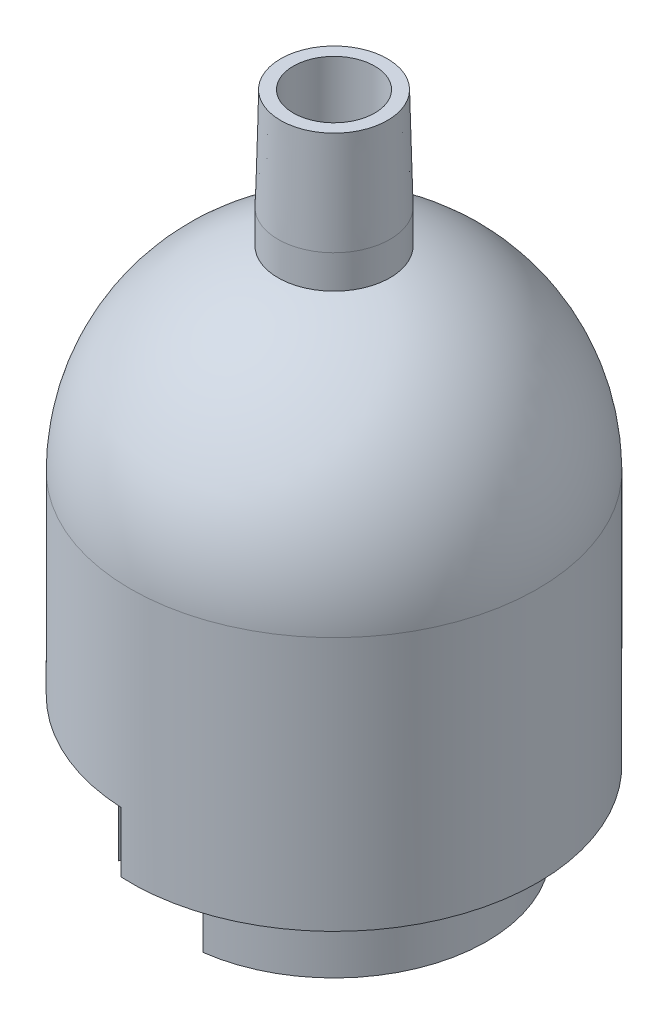
ISO-10303-21;
HEADER;
FILE_DESCRIPTION(('STEP AP214'),'2;1');
FILE_NAME('part.step','',(''),(''),'','','');
FILE_SCHEMA(('AUTOMOTIVE_DESIGN { 1 0 10303 214 1 1 1 1 }'));
ENDSEC;
DATA;
#1=APPLICATION_CONTEXT('core data for automotive mechanical design processes');
#2=APPLICATION_PROTOCOL_DEFINITION('international standard','automotive_design',2000,#1);
#3=PRODUCT_CONTEXT('',#1,'mechanical');
#4=PRODUCT('Part','Part','',(#3));
#5=PRODUCT_RELATED_PRODUCT_CATEGORY('part','',(#4));
#6=PRODUCT_DEFINITION_FORMATION('','',#4);
#7=PRODUCT_DEFINITION_CONTEXT('part definition',#1,'design');
#8=PRODUCT_DEFINITION('design','',#6,#7);
#9=PRODUCT_DEFINITION_SHAPE('','',#8);
#10=(LENGTH_UNIT() NAMED_UNIT(*) SI_UNIT(.MILLI.,.METRE.));
#11=(NAMED_UNIT(*) PLANE_ANGLE_UNIT() SI_UNIT($,.RADIAN.));
#12=(NAMED_UNIT(*) SI_UNIT($,.STERADIAN.) SOLID_ANGLE_UNIT());
#13=UNCERTAINTY_MEASURE_WITH_UNIT(LENGTH_MEASURE(1.E-05),#10,'distance_accuracy_value','');
#14=(GEOMETRIC_REPRESENTATION_CONTEXT(3) GLOBAL_UNCERTAINTY_ASSIGNED_CONTEXT((#13)) GLOBAL_UNIT_ASSIGNED_CONTEXT((#10,
#11,#12)) REPRESENTATION_CONTEXT('',''));
#15=CARTESIAN_POINT('',(0.,0.,0.));
#16=DIRECTION('',(0.,0.,1.));
#17=DIRECTION('',(1.,0.,0.));
#18=AXIS2_PLACEMENT_3D('',#15,#16,#17);
#19=CARTESIAN_POINT('',(0.,0.,0.));
#20=DIRECTION('',(0.,1.,0.));
#21=DIRECTION('',(0.,0.,1.));
#22=AXIS2_PLACEMENT_3D('',#19,#20,#21);
#23=PLANE('',#22);
#24=CARTESIAN_POINT('',(-14.4274561926336,0.,-19.8576898619304));
#25=DIRECTION('',(0.,-1.,0.));
#26=DIRECTION('',(0.,0.,-1.));
#27=AXIS2_PLACEMENT_3D('',#24,#25,#26);
#28=CIRCLE('',#27,1.02272727272727);
#29=CARTESIAN_POINT('',(-14.4274561926336,0.,-20.8804171346577));
#30=VERTEX_POINT('',#29);
#31=EDGE_CURVE('E284',#30,#30,#28,.T.);
#32=ORIENTED_EDGE('',*,*,#31,.F.);
#33=EDGE_LOOP('',(#32));
#34=FACE_BOUND('',#33,.T.);
#35=CARTESIAN_POINT('',(-23.3441144908811,0.,-7.58496258920303));
#36=DIRECTION('',(0.,-1.,0.));
#37=DIRECTION('',(0.,0.,-1.));
#38=AXIS2_PLACEMENT_3D('',#35,#36,#37);
#39=CIRCLE('',#38,1.02272727272727);
#40=CARTESIAN_POINT('',(-23.3441144908811,0.,-8.6076898619303));
#41=VERTEX_POINT('',#40);
#42=EDGE_CURVE('E267',#41,#41,#39,.T.);
#43=ORIENTED_EDGE('',*,*,#42,.F.);
#44=EDGE_LOOP('',(#43));
#45=FACE_BOUND('',#44,.T.);
#46=CARTESIAN_POINT('',(-23.344114490881,0.,7.58496258920352));
#47=DIRECTION('',(0.,-1.,0.));
#48=DIRECTION('',(0.,0.,-1.));
#49=AXIS2_PLACEMENT_3D('',#46,#47,#48);
#50=CIRCLE('',#49,1.02272727272727);
#51=CARTESIAN_POINT('',(-23.344114490881,0.,6.56223531647624));
#52=VERTEX_POINT('',#51);
#53=EDGE_CURVE('E238',#52,#52,#50,.T.);
#54=ORIENTED_EDGE('',*,*,#53,.F.);
#55=EDGE_LOOP('',(#54));
#56=FACE_BOUND('',#55,.T.);
#57=DIRECTION('',(-0.819178042205052,0.,0.573539305688021));
#58=VECTOR('',#57,1.);
#59=CARTESIAN_POINT('',(-2.60200663660479,0.,-3.71640911309731));
#60=LINE('',#59,#58);
#61=CARTESIAN_POINT('',(-20.6549486371412,0.,8.92317750563435));
#62=VERTEX_POINT('',#61);
#63=CARTESIAN_POINT('',(-24.6319495458198,0.,11.7076348792039));
#64=VERTEX_POINT('',#63);
#65=EDGE_CURVE('E203',#62,#64,#60,.T.);
#66=ORIENTED_EDGE('',*,*,#65,.T.);
#67=CARTESIAN_POINT('',(0.,0.,0.));
#68=DIRECTION('',(0.,1.,0.));
#69=DIRECTION('',(0.,0.,1.));
#70=AXIS2_PLACEMENT_3D('',#67,#68,#69);
#71=CIRCLE('',#70,27.2727272727273);
#72=CARTESIAN_POINT('',(-13.2994690319406,0.,-23.8102031986503));
#73=VERTEX_POINT('',#72);
#74=EDGE_CURVE('E67',#73,#64,#71,.T.);
#75=ORIENTED_EDGE('',*,*,#74,.F.);
#76=DIRECTION('',(-0.487647197837817,0.,-0.873040783950512));
#77=VECTOR('',#76,1.);
#78=CARTESIAN_POINT('',(0.,0.,0.));
#79=LINE('',#78,#77);
#80=CARTESIAN_POINT('',(-10.972061951351,0.,-19.6434176388865));
#81=VERTEX_POINT('',#80);
#82=EDGE_CURVE('E230',#81,#73,#79,.T.);
#83=ORIENTED_EDGE('',*,*,#82,.F.);
#84=CARTESIAN_POINT('',(0.,0.,0.));
#85=DIRECTION('',(0.,-1.,0.));
#86=DIRECTION('',(0.,0.,-1.));
#87=AXIS2_PLACEMENT_3D('',#84,#85,#86);
#88=CIRCLE('',#87,22.5);
#89=EDGE_CURVE('E227',#62,#81,#88,.T.);
#90=ORIENTED_EDGE('',*,*,#89,.F.);
#91=EDGE_LOOP('',(#66,#75,#83,#90));
#92=FACE_BOUND('',#91,.T.);
#93=ADVANCED_FACE('F56',(#34,#45,#56,#92),#23,.F.);
#94=CARTESIAN_POINT('',(0.,34.0909090909091,0.));
#95=DIRECTION('',(0.,-1.,0.));
#96=DIRECTION('',(0.,0.,-1.));
#97=AXIS2_PLACEMENT_3D('',#94,#95,#96);
#98=CYLINDRICAL_SURFACE('',#97,27.2727272727273);
#99=CARTESIAN_POINT('',(0.,34.0909090909091,0.));
#100=DIRECTION('',(0.,1.,0.));
#101=DIRECTION('',(0.,0.,1.));
#102=AXIS2_PLACEMENT_3D('',#99,#100,#101);
#103=CIRCLE('',#102,27.2727272727273);
#104=CARTESIAN_POINT('',(0.,34.0909090909091,27.2727272727273));
#105=VERTEX_POINT('',#104);
#106=EDGE_CURVE('E12',#105,#105,#103,.T.);
#107=ORIENTED_EDGE('',*,*,#106,.F.);
#108=EDGE_LOOP('',(#107));
#109=FACE_BOUND('',#108,.T.);
#110=DIRECTION('',(0.,-1.,0.));
#111=VECTOR('',#110,1.);
#112=CARTESIAN_POINT('',(-24.6319495458198,8.07952961590909,11.7076348792039));
#113=LINE('',#112,#111);
#114=CARTESIAN_POINT('',(-24.6319495458198,8.07952961590909,11.7076348792039));
#115=VERTEX_POINT('',#114);
#116=EDGE_CURVE('E236',#115,#64,#113,.T.);
#117=ORIENTED_EDGE('',*,*,#116,.F.);
#118=CARTESIAN_POINT('',(0.,8.07952961590909,0.));
#119=DIRECTION('',(0.,-1.,0.));
#120=DIRECTION('',(0.,0.,-1.));
#121=AXIS2_PLACEMENT_3D('',#118,#119,#120);
#122=CIRCLE('',#121,27.2727272727273);
#123=CARTESIAN_POINT('',(-1.32991168102371,8.07952961590909,27.2402824473837));
#124=VERTEX_POINT('',#123);
#125=EDGE_CURVE('E217',#124,#115,#122,.T.);
#126=ORIENTED_EDGE('',*,*,#125,.F.);
#127=DIRECTION('',(0.,-1.,0.));
#128=VECTOR('',#127,1.);
#129=CARTESIAN_POINT('',(-1.32991168102371,8.07952961590909,27.2402824473837));
#130=LINE('',#129,#128);
#131=CARTESIAN_POINT('',(-1.32991168102371,0.,27.2402824473837));
#132=VERTEX_POINT('',#131);
#133=EDGE_CURVE('E239',#124,#132,#130,.T.);
#134=ORIENTED_EDGE('',*,*,#133,.T.);
#135=CARTESIAN_POINT('',(2.86184323157071,0.,-27.1221589518695));
#136=VERTEX_POINT('',#135);
#137=EDGE_CURVE('E293',#132,#136,#71,.T.);
#138=ORIENTED_EDGE('',*,*,#137,.T.);
#139=DIRECTION('',(0.,-1.,0.));
#140=VECTOR('',#139,1.);
#141=CARTESIAN_POINT('',(2.86184323157071,8.07952961590909,-27.1221589518695));
#142=LINE('',#141,#140);
#143=CARTESIAN_POINT('',(2.86184323157071,8.07952961590909,-27.1221589518695));
#144=VERTEX_POINT('',#143);
#145=EDGE_CURVE('E247',#144,#136,#142,.T.);
#146=ORIENTED_EDGE('',*,*,#145,.F.);
#147=CARTESIAN_POINT('',(-13.2994690319406,8.07952961590909,-23.8102031986503));
#148=VERTEX_POINT('',#147);
#149=EDGE_CURVE('E213',#148,#144,#122,.T.);
#150=ORIENTED_EDGE('',*,*,#149,.F.);
#151=DIRECTION('',(0.,-1.,0.));
#152=VECTOR('',#151,1.);
#153=CARTESIAN_POINT('',(-13.2994690319406,8.07952961590909,-23.8102031986503));
#154=LINE('',#153,#152);
#155=EDGE_CURVE('E249',#148,#73,#154,.T.);
#156=ORIENTED_EDGE('',*,*,#155,.T.);
#157=ORIENTED_EDGE('',*,*,#74,.T.);
#158=EDGE_LOOP('',(#117,#126,#134,#138,#146,#150,#156,#157));
#159=FACE_BOUND('',#158,.T.);
#160=ADVANCED_FACE('F58',(#109,#159),#98,.T.);
#161=CARTESIAN_POINT('',(14.4274561926335,0.,19.8576898619305));
#162=DIRECTION('',(0.,-1.,0.));
#163=DIRECTION('',(0.,0.,-1.));
#164=AXIS2_PLACEMENT_3D('',#161,#162,#163);
#165=CIRCLE('',#164,1.02272727272728);
#166=CARTESIAN_POINT('',(14.4274561926335,0.,18.8349625892032));
#167=VERTEX_POINT('',#166);
#168=EDGE_CURVE('E260',#167,#167,#165,.T.);
#169=ORIENTED_EDGE('',*,*,#168,.F.);
#170=EDGE_LOOP('',(#169));
#171=FACE_BOUND('',#170,.T.);
#172=CARTESIAN_POINT('',(23.344114490881,0.,-7.58496258920336));
#173=DIRECTION('',(0.,-1.,0.));
#174=DIRECTION('',(0.,0.,-1.));
#175=AXIS2_PLACEMENT_3D('',#172,#173,#174);
#176=CIRCLE('',#175,1.02272727272727);
#177=CARTESIAN_POINT('',(23.344114490881,0.,-8.60768986193063));
#178=VERTEX_POINT('',#177);
#179=EDGE_CURVE('E278',#178,#178,#176,.T.);
#180=ORIENTED_EDGE('',*,*,#179,.F.);
#181=EDGE_LOOP('',(#180));
#182=FACE_BOUND('',#181,.T.);
#183=CARTESIAN_POINT('',(23.3441144908811,0.,7.58496258920319));
#184=DIRECTION('',(0.,-1.,0.));
#185=DIRECTION('',(0.,0.,-1.));
#186=AXIS2_PLACEMENT_3D('',#183,#184,#185);
#187=CIRCLE('',#186,1.02272727272727);
#188=CARTESIAN_POINT('',(23.3441144908811,0.,6.56223531647592));
#189=VERTEX_POINT('',#188);
#190=EDGE_CURVE('E272',#189,#189,#187,.T.);
#191=ORIENTED_EDGE('',*,*,#190,.F.);
#192=EDGE_LOOP('',(#191));
#193=FACE_BOUND('',#192,.T.);
#194=ORIENTED_EDGE('',*,*,#137,.F.);
#195=DIRECTION('',(-0.0487634283041756,0.,0.998810356404069));
#196=VECTOR('',#195,1.);
#197=CARTESIAN_POINT('',(-7.34952928272318E-13,0.,0.));
#198=LINE('',#197,#196);
#199=CARTESIAN_POINT('',(-0.997433760767963,0.,20.4302118355377));
#200=VERTEX_POINT('',#199);
#201=EDGE_CURVE('E207',#200,#132,#198,.T.);
#202=ORIENTED_EDGE('',*,*,#201,.F.);
#203=CARTESIAN_POINT('',(0.,0.,0.));
#204=DIRECTION('',(0.,1.,0.));
#205=DIRECTION('',(0.,0.,1.));
#206=AXIS2_PLACEMENT_3D('',#203,#204,#205);
#207=CIRCLE('',#206,20.4545454545454);
#208=CARTESIAN_POINT('',(2.73329906518753,0.,20.2711002654595));
#209=VERTEX_POINT('',#208);
#210=EDGE_CURVE('E259',#200,#209,#207,.T.);
#211=ORIENTED_EDGE('',*,*,#210,.T.);
#212=CARTESIAN_POINT('',(0.,0.,0.));
#213=DIRECTION('',(0.,1.,0.));
#214=DIRECTION('',(0.,0.,1.));
#215=AXIS2_PLACEMENT_3D('',#212,#213,#214);
#216=CIRCLE('',#215,20.4545454545454);
#217=CARTESIAN_POINT('',(2.14638242367765,0.,-20.3416192139022));
#218=VERTEX_POINT('',#217);
#219=EDGE_CURVE('E197',#209,#218,#216,.T.);
#220=ORIENTED_EDGE('',*,*,#219,.T.);
#221=DIRECTION('',(0.104934251824316,0.,-0.994479161568542));
#222=VECTOR('',#221,1.);
#223=CARTESIAN_POINT('',(-1.54439806012414E-12,0.,-1.62959930404618E-13));
#224=LINE('',#223,#222);
#225=EDGE_CURVE('E232',#218,#136,#224,.T.);
#226=ORIENTED_EDGE('',*,*,#225,.T.);
#227=EDGE_LOOP('',(#194,#202,#211,#220,#226));
#228=FACE_BOUND('',#227,.T.);
#229=ADVANCED_FACE('F359',(#171,#182,#193,#228),#23,.F.);
#230=CARTESIAN_POINT('',(0.,34.0909090909091,0.));
#231=DIRECTION('',(0.,-1.,0.));
#232=DIRECTION('',(0.,0.,-1.));
#233=AXIS2_PLACEMENT_3D('',#230,#231,#232);
#234=CYLINDRICAL_SURFACE('',#233,20.4545454545454);
#235=DIRECTION('',(0.,-1.,0.));
#236=VECTOR('',#235,1.);
#237=CARTESIAN_POINT('',(2.73329906518752,14.8977114340909,20.2711002654595));
#238=LINE('',#237,#236);
#239=CARTESIAN_POINT('',(2.73329906518753,14.8977114340909,20.2711002654595));
#240=VERTEX_POINT('',#239);
#241=EDGE_CURVE('E198',#240,#209,#238,.T.);
#242=ORIENTED_EDGE('',*,*,#241,.T.);
#243=ORIENTED_EDGE('',*,*,#210,.F.);
#244=DIRECTION('',(0.,-1.,0.));
#245=VECTOR('',#244,1.);
#246=CARTESIAN_POINT('',(-0.997433760767963,8.07952961590909,20.4302118355377));
#247=LINE('',#246,#245);
#248=CARTESIAN_POINT('',(-0.997433760767963,8.07952961590909,20.4302118355377));
#249=VERTEX_POINT('',#248);
#250=EDGE_CURVE('E242',#249,#200,#247,.T.);
#251=ORIENTED_EDGE('',*,*,#250,.F.);
#252=CARTESIAN_POINT('',(0.,8.07952961590909,0.));
#253=DIRECTION('',(0.,-1.,0.));
#254=DIRECTION('',(0.,0.,-1.));
#255=AXIS2_PLACEMENT_3D('',#252,#253,#254);
#256=CIRCLE('',#255,20.4545454545454);
#257=CARTESIAN_POINT('',(-13.5744823650331,8.07952961590909,15.301041084628));
#258=VERTEX_POINT('',#257);
#259=EDGE_CURVE('E220',#249,#258,#256,.T.);
#260=ORIENTED_EDGE('',*,*,#259,.T.);
#261=DIRECTION('',(0.,-1.,0.));
#262=VECTOR('',#261,1.);
#263=CARTESIAN_POINT('',(-13.5744823650331,14.8977114340909,15.301041084628));
#264=LINE('',#263,#262);
#265=CARTESIAN_POINT('',(-13.5744823650331,14.8977114340909,15.301041084628));
#266=VERTEX_POINT('',#265);
#267=EDGE_CURVE('E80',#266,#258,#264,.T.);
#268=ORIENTED_EDGE('',*,*,#267,.F.);
#269=CARTESIAN_POINT('',(0.,14.8977114340909,0.));
#270=DIRECTION('',(0.,-1.,0.));
#271=DIRECTION('',(0.,0.,-1.));
#272=AXIS2_PLACEMENT_3D('',#269,#270,#271);
#273=CIRCLE('',#272,20.4545454545454);
#274=EDGE_CURVE('E75',#266,#240,#273,.T.);
#275=ORIENTED_EDGE('',*,*,#274,.T.);
#276=EDGE_LOOP('',(#242,#243,#251,#260,#268,#275));
#277=FACE_BOUND('',#276,.T.);
#278=CARTESIAN_POINT('',(0.,34.0909090909091,0.));
#279=DIRECTION('',(0.,1.,0.));
#280=DIRECTION('',(0.,0.,-1.));
#281=AXIS2_PLACEMENT_3D('',#278,#279,#280);
#282=CIRCLE('',#281,20.4545454545454);
#283=CARTESIAN_POINT('',(0.,34.0909090909092,-20.4545454545454));
#284=VERTEX_POINT('',#283);
#285=EDGE_CURVE('E180',#284,#284,#282,.T.);
#286=ORIENTED_EDGE('',*,*,#285,.T.);
#287=EDGE_LOOP('',(#286));
#288=FACE_BOUND('',#287,.T.);
#289=ADVANCED_FACE('F368',(#277,#288),#234,.F.);
#290=CARTESIAN_POINT('',(23.3441144908811,6.81818181818182,7.58496258920319));
#291=DIRECTION('',(0.,-1.,0.));
#292=DIRECTION('',(0.,0.,-1.));
#293=AXIS2_PLACEMENT_3D('',#290,#291,#292);
#294=CYLINDRICAL_SURFACE('',#293,1.02272727272727);
#295=CARTESIAN_POINT('',(23.3441144908811,6.81818181818182,7.58496258920319));
#296=DIRECTION('',(0.,-1.,0.));
#297=DIRECTION('',(0.,0.,-1.));
#298=AXIS2_PLACEMENT_3D('',#295,#296,#297);
#299=CIRCLE('',#298,1.02272727272727);
#300=CARTESIAN_POINT('',(23.3441144908811,6.81818181818182,6.56223531647592));
#301=VERTEX_POINT('',#300);
#302=EDGE_CURVE('E263',#301,#301,#299,.T.);
#303=ORIENTED_EDGE('',*,*,#302,.F.);
#304=EDGE_LOOP('',(#303));
#305=FACE_BOUND('',#304,.T.);
#306=ORIENTED_EDGE('',*,*,#190,.T.);
#307=EDGE_LOOP('',(#306));
#308=FACE_BOUND('',#307,.T.);
#309=ADVANCED_FACE('F373',(#305,#308),#294,.F.);
#310=CARTESIAN_POINT('',(23.3441144908811,6.81818181818182,7.58496258920319));
#311=DIRECTION('',(0.,-1.,0.));
#312=DIRECTION('',(0.,0.,-1.));
#313=AXIS2_PLACEMENT_3D('',#310,#311,#312);
#314=PLANE('',#313);
#315=ORIENTED_EDGE('',*,*,#302,.T.);
#316=EDGE_LOOP('',(#315));
#317=FACE_BOUND('',#316,.T.);
#318=ADVANCED_FACE('F454',(#317),#314,.T.);
#319=CARTESIAN_POINT('',(23.344114490881,6.81818181818182,-7.58496258920336));
#320=DIRECTION('',(0.,-1.,0.));
#321=DIRECTION('',(0.,0.,-1.));
#322=AXIS2_PLACEMENT_3D('',#319,#320,#321);
#323=CYLINDRICAL_SURFACE('',#322,1.02272727272727);
#324=CARTESIAN_POINT('',(23.344114490881,6.81818181818182,-7.58496258920336));
#325=DIRECTION('',(0.,-1.,0.));
#326=DIRECTION('',(0.,0.,-1.));
#327=AXIS2_PLACEMENT_3D('',#324,#325,#326);
#328=CIRCLE('',#327,1.02272727272727);
#329=CARTESIAN_POINT('',(23.344114490881,6.81818181818182,-8.60768986193063));
#330=VERTEX_POINT('',#329);
#331=EDGE_CURVE('E275',#330,#330,#328,.T.);
#332=ORIENTED_EDGE('',*,*,#331,.F.);
#333=EDGE_LOOP('',(#332));
#334=FACE_BOUND('',#333,.T.);
#335=ORIENTED_EDGE('',*,*,#179,.T.);
#336=EDGE_LOOP('',(#335));
#337=FACE_BOUND('',#336,.T.);
#338=ADVANCED_FACE('F457',(#334,#337),#323,.F.);
#339=CARTESIAN_POINT('',(23.344114490881,6.81818181818182,-7.58496258920336));
#340=DIRECTION('',(0.,-1.,0.));
#341=DIRECTION('',(0.,0.,-1.));
#342=AXIS2_PLACEMENT_3D('',#339,#340,#341);
#343=PLANE('',#342);
#344=ORIENTED_EDGE('',*,*,#331,.T.);
#345=EDGE_LOOP('',(#344));
#346=FACE_BOUND('',#345,.T.);
#347=ADVANCED_FACE('F462',(#346),#343,.T.);
#348=CARTESIAN_POINT('',(-14.4274561926336,6.81818181818182,-19.8576898619304));
#349=DIRECTION('',(0.,-1.,0.));
#350=DIRECTION('',(0.,0.,-1.));
#351=AXIS2_PLACEMENT_3D('',#348,#349,#350);
#352=CYLINDRICAL_SURFACE('',#351,1.02272727272727);
#353=CARTESIAN_POINT('',(-14.4274561926336,6.81818181818182,-19.8576898619304));
#354=DIRECTION('',(0.,-1.,0.));
#355=DIRECTION('',(0.,0.,-1.));
#356=AXIS2_PLACEMENT_3D('',#353,#354,#355);
#357=CIRCLE('',#356,1.02272727272727);
#358=CARTESIAN_POINT('',(-14.4274561926336,6.81818181818182,-20.8804171346577));
#359=VERTEX_POINT('',#358);
#360=EDGE_CURVE('E281',#359,#359,#357,.T.);
#361=ORIENTED_EDGE('',*,*,#360,.F.);
#362=EDGE_LOOP('',(#361));
#363=FACE_BOUND('',#362,.T.);
#364=ORIENTED_EDGE('',*,*,#31,.T.);
#365=EDGE_LOOP('',(#364));
#366=FACE_BOUND('',#365,.T.);
#367=ADVANCED_FACE('F465',(#363,#366),#352,.F.);
#368=CARTESIAN_POINT('',(-14.4274561926336,6.81818181818182,-19.8576898619304));
#369=DIRECTION('',(0.,-1.,0.));
#370=DIRECTION('',(0.,0.,-1.));
#371=AXIS2_PLACEMENT_3D('',#368,#369,#370);
#372=PLANE('',#371);
#373=ORIENTED_EDGE('',*,*,#360,.T.);
#374=EDGE_LOOP('',(#373));
#375=FACE_BOUND('',#374,.T.);
#376=ADVANCED_FACE('F470',(#375),#372,.T.);
#377=CARTESIAN_POINT('',(-23.3441144908811,6.81818181818182,-7.58496258920303));
#378=DIRECTION('',(0.,-1.,0.));
#379=DIRECTION('',(0.,0.,-1.));
#380=AXIS2_PLACEMENT_3D('',#377,#378,#379);
#381=CYLINDRICAL_SURFACE('',#380,1.02272727272727);
#382=CARTESIAN_POINT('',(-23.3441144908811,6.81818181818182,-7.58496258920303));
#383=DIRECTION('',(0.,-1.,0.));
#384=DIRECTION('',(0.,0.,-1.));
#385=AXIS2_PLACEMENT_3D('',#382,#383,#384);
#386=CIRCLE('',#385,1.02272727272727);
#387=CARTESIAN_POINT('',(-23.3441144908811,6.81818181818182,-8.6076898619303));
#388=VERTEX_POINT('',#387);
#389=EDGE_CURVE('E287',#388,#388,#386,.T.);
#390=ORIENTED_EDGE('',*,*,#389,.F.);
#391=EDGE_LOOP('',(#390));
#392=FACE_BOUND('',#391,.T.);
#393=ORIENTED_EDGE('',*,*,#42,.T.);
#394=EDGE_LOOP('',(#393));
#395=FACE_BOUND('',#394,.T.);
#396=ADVANCED_FACE('F473',(#392,#395),#381,.F.);
#397=CARTESIAN_POINT('',(-23.3441144908811,6.81818181818182,-7.58496258920303));
#398=DIRECTION('',(0.,-1.,0.));
#399=DIRECTION('',(0.,0.,-1.));
#400=AXIS2_PLACEMENT_3D('',#397,#398,#399);
#401=PLANE('',#400);
#402=ORIENTED_EDGE('',*,*,#389,.T.);
#403=EDGE_LOOP('',(#402));
#404=FACE_BOUND('',#403,.T.);
#405=ADVANCED_FACE('F452',(#404),#401,.T.);
#406=CARTESIAN_POINT('',(-23.344114490881,6.81818181818182,7.58496258920352));
#407=DIRECTION('',(0.,-1.,0.));
#408=DIRECTION('',(0.,0.,-1.));
#409=AXIS2_PLACEMENT_3D('',#406,#407,#408);
#410=CYLINDRICAL_SURFACE('',#409,1.02272727272727);
#411=CARTESIAN_POINT('',(-23.344114490881,6.81818181818182,7.58496258920352));
#412=DIRECTION('',(0.,-1.,0.));
#413=DIRECTION('',(0.,0.,-1.));
#414=AXIS2_PLACEMENT_3D('',#411,#412,#413);
#415=CIRCLE('',#414,1.02272727272727);
#416=CARTESIAN_POINT('',(-23.344114490881,6.81818181818182,6.56223531647624));
#417=VERTEX_POINT('',#416);
#418=EDGE_CURVE('E264',#417,#417,#415,.T.);
#419=ORIENTED_EDGE('',*,*,#418,.F.);
#420=EDGE_LOOP('',(#419));
#421=FACE_BOUND('',#420,.T.);
#422=ORIENTED_EDGE('',*,*,#53,.T.);
#423=EDGE_LOOP('',(#422));
#424=FACE_BOUND('',#423,.T.);
#425=ADVANCED_FACE('F448',(#421,#424),#410,.F.);
#426=CARTESIAN_POINT('',(-23.344114490881,6.81818181818182,7.58496258920352));
#427=DIRECTION('',(0.,-1.,0.));
#428=DIRECTION('',(0.,0.,-1.));
#429=AXIS2_PLACEMENT_3D('',#426,#427,#428);
#430=PLANE('',#429);
#431=ORIENTED_EDGE('',*,*,#418,.T.);
#432=EDGE_LOOP('',(#431));
#433=FACE_BOUND('',#432,.T.);
#434=ADVANCED_FACE('F444',(#433),#430,.T.);
#435=CARTESIAN_POINT('',(14.4274561926335,6.81818181818182,19.8576898619305));
#436=DIRECTION('',(0.,-1.,0.));
#437=DIRECTION('',(0.,0.,-1.));
#438=AXIS2_PLACEMENT_3D('',#435,#436,#437);
#439=CYLINDRICAL_SURFACE('',#438,1.02272727272728);
#440=CARTESIAN_POINT('',(14.4274561926335,6.81818181818182,19.8576898619305));
#441=DIRECTION('',(0.,-1.,0.));
#442=DIRECTION('',(0.,0.,-1.));
#443=AXIS2_PLACEMENT_3D('',#440,#441,#442);
#444=CIRCLE('',#443,1.02272727272728);
#445=CARTESIAN_POINT('',(14.4274561926335,6.81818181818182,18.8349625892032));
#446=VERTEX_POINT('',#445);
#447=EDGE_CURVE('E256',#446,#446,#444,.T.);
#448=ORIENTED_EDGE('',*,*,#447,.F.);
#449=EDGE_LOOP('',(#448));
#450=FACE_BOUND('',#449,.T.);
#451=ORIENTED_EDGE('',*,*,#168,.T.);
#452=EDGE_LOOP('',(#451));
#453=FACE_BOUND('',#452,.T.);
#454=ADVANCED_FACE('F440',(#450,#453),#439,.F.);
#455=CARTESIAN_POINT('',(14.4274561926335,6.81818181818182,19.8576898619305));
#456=DIRECTION('',(0.,-1.,0.));
#457=DIRECTION('',(0.,0.,-1.));
#458=AXIS2_PLACEMENT_3D('',#455,#456,#457);
#459=PLANE('',#458);
#460=ORIENTED_EDGE('',*,*,#447,.T.);
#461=EDGE_LOOP('',(#460));
#462=FACE_BOUND('',#461,.T.);
#463=ADVANCED_FACE('F437',(#462),#459,.T.);
#464=CARTESIAN_POINT('',(-2.60200663660479,8.07952961590909,-3.71640911309731));
#465=DIRECTION('',(0.573539305688021,0.,0.819178042205052));
#466=DIRECTION('',(0.819178042205053,0.,-0.573539305688021));
#467=AXIS2_PLACEMENT_3D('',#464,#465,#466);
#468=PLANE('',#467);
#469=ORIENTED_EDGE('',*,*,#65,.F.);
#470=DIRECTION('',(0.,-1.,0.));
#471=VECTOR('',#470,1.);
#472=CARTESIAN_POINT('',(-20.6549486371412,8.07952961590909,8.92317750563435));
#473=LINE('',#472,#471);
#474=CARTESIAN_POINT('',(-20.6549486371412,8.07952961590909,8.92317750563435));
#475=VERTEX_POINT('',#474);
#476=EDGE_CURVE('E254',#475,#62,#473,.T.);
#477=ORIENTED_EDGE('',*,*,#476,.F.);
#478=DIRECTION('',(-0.819178042205052,0.,0.573539305688021));
#479=VECTOR('',#478,1.);
#480=CARTESIAN_POINT('',(-2.60200663660479,8.07952961590909,-3.71640911309731));
#481=LINE('',#480,#479);
#482=EDGE_CURVE('E204',#475,#115,#481,.T.);
#483=ORIENTED_EDGE('',*,*,#482,.T.);
#484=ORIENTED_EDGE('',*,*,#116,.T.);
#485=EDGE_LOOP('',(#469,#477,#483,#484));
#486=FACE_BOUND('',#485,.T.);
#487=ADVANCED_FACE('F420',(#486),#468,.T.);
#488=CARTESIAN_POINT('',(-7.34952928272318E-13,8.07952961590909,0.));
#489=DIRECTION('',(0.998810356404069,0.,0.0487634283041756));
#490=DIRECTION('',(0.0487634283041756,0.,-0.998810356404069));
#491=AXIS2_PLACEMENT_3D('',#488,#489,#490);
#492=PLANE('',#491);
#493=ORIENTED_EDGE('',*,*,#201,.T.);
#494=ORIENTED_EDGE('',*,*,#133,.F.);
#495=DIRECTION('',(-0.0487634283041756,0.,0.998810356404069));
#496=VECTOR('',#495,1.);
#497=CARTESIAN_POINT('',(-7.34952928272318E-13,8.07952961590909,0.));
#498=LINE('',#497,#496);
#499=EDGE_CURVE('E222',#249,#124,#498,.T.);
#500=ORIENTED_EDGE('',*,*,#499,.F.);
#501=ORIENTED_EDGE('',*,*,#250,.T.);
#502=EDGE_LOOP('',(#493,#494,#500,#501));
#503=FACE_BOUND('',#502,.T.);
#504=ADVANCED_FACE('F392',(#503),#492,.F.);
#505=CARTESIAN_POINT('',(-1.54439806012414E-12,8.07952961590909,-1.62959930404618E-13));
#506=DIRECTION('',(-0.994479161568543,0.,-0.104934251824316));
#507=DIRECTION('',(-0.104934251824316,0.,0.994479161568543));
#508=AXIS2_PLACEMENT_3D('',#505,#506,#507);
#509=PLANE('',#508);
#510=ORIENTED_EDGE('',*,*,#225,.F.);
#511=DIRECTION('',(0.,-1.,0.));
#512=VECTOR('',#511,1.);
#513=CARTESIAN_POINT('',(2.14638242367765,8.07952961590909,-20.3416192139022));
#514=LINE('',#513,#512);
#515=CARTESIAN_POINT('',(2.14638242367765,8.07952961590909,-20.3416192139022));
#516=VERTEX_POINT('',#515);
#517=EDGE_CURVE('E244',#516,#218,#514,.T.);
#518=ORIENTED_EDGE('',*,*,#517,.F.);
#519=DIRECTION('',(0.104934251824316,0.,-0.994479161568542));
#520=VECTOR('',#519,1.);
#521=CARTESIAN_POINT('',(-1.54439806012414E-12,8.07952961590909,-1.62959930404618E-13));
#522=LINE('',#521,#520);
#523=EDGE_CURVE('E216',#516,#144,#522,.T.);
#524=ORIENTED_EDGE('',*,*,#523,.T.);
#525=ORIENTED_EDGE('',*,*,#145,.T.);
#526=EDGE_LOOP('',(#510,#518,#524,#525));
#527=FACE_BOUND('',#526,.T.);
#528=ADVANCED_FACE('F410',(#527),#509,.T.);
#529=CARTESIAN_POINT('',(0.,8.07952961590909,0.));
#530=DIRECTION('',(-0.873040783950512,0.,0.487647197837817));
#531=DIRECTION('',(0.487647197837817,0.,0.873040783950512));
#532=AXIS2_PLACEMENT_3D('',#529,#530,#531);
#533=PLANE('',#532);
#534=ORIENTED_EDGE('',*,*,#82,.T.);
#535=ORIENTED_EDGE('',*,*,#155,.F.);
#536=DIRECTION('',(-0.487647197837817,0.,-0.873040783950512));
#537=VECTOR('',#536,1.);
#538=CARTESIAN_POINT('',(0.,8.07952961590909,0.));
#539=LINE('',#538,#537);
#540=CARTESIAN_POINT('',(-10.972061951351,8.07952961590909,-19.6434176388865));
#541=VERTEX_POINT('',#540);
#542=EDGE_CURVE('E210',#541,#148,#539,.T.);
#543=ORIENTED_EDGE('',*,*,#542,.F.);
#544=DIRECTION('',(0.,-1.,0.));
#545=VECTOR('',#544,1.);
#546=CARTESIAN_POINT('',(-10.972061951351,8.07952961590909,-19.6434176388865));
#547=LINE('',#546,#545);
#548=EDGE_CURVE('E252',#541,#81,#547,.T.);
#549=ORIENTED_EDGE('',*,*,#548,.T.);
#550=EDGE_LOOP('',(#534,#535,#543,#549));
#551=FACE_BOUND('',#550,.T.);
#552=ADVANCED_FACE('F424',(#551),#533,.F.);
#553=CARTESIAN_POINT('',(0.,8.07952961590909,0.));
#554=DIRECTION('',(0.,-1.,0.));
#555=DIRECTION('',(0.,0.,-1.));
#556=AXIS2_PLACEMENT_3D('',#553,#554,#555);
#557=CYLINDRICAL_SURFACE('',#556,22.5);
#558=ORIENTED_EDGE('',*,*,#89,.T.);
#559=ORIENTED_EDGE('',*,*,#548,.F.);
#560=CARTESIAN_POINT('',(0.,8.07952961590909,0.));
#561=DIRECTION('',(0.,-1.,0.));
#562=DIRECTION('',(0.,0.,-1.));
#563=AXIS2_PLACEMENT_3D('',#560,#561,#562);
#564=CIRCLE('',#563,22.5);
#565=EDGE_CURVE('E206',#475,#541,#564,.T.);
#566=ORIENTED_EDGE('',*,*,#565,.F.);
#567=ORIENTED_EDGE('',*,*,#476,.T.);
#568=EDGE_LOOP('',(#558,#559,#566,#567));
#569=FACE_BOUND('',#568,.T.);
#570=ADVANCED_FACE('F423',(#569),#557,.F.);
#571=CARTESIAN_POINT('',(0.,8.07952961590909,0.));
#572=DIRECTION('',(0.,-1.,0.));
#573=DIRECTION('',(0.,0.,-1.));
#574=AXIS2_PLACEMENT_3D('',#571,#572,#573);
#575=PLANE('',#574);
#576=ORIENTED_EDGE('',*,*,#482,.F.);
#577=ORIENTED_EDGE('',*,*,#565,.T.);
#578=ORIENTED_EDGE('',*,*,#542,.T.);
#579=ORIENTED_EDGE('',*,*,#149,.T.);
#580=ORIENTED_EDGE('',*,*,#523,.F.);
#581=EDGE_CURVE('E219',#258,#516,#256,.T.);
#582=ORIENTED_EDGE('',*,*,#581,.F.);
#583=ORIENTED_EDGE('',*,*,#259,.F.);
#584=ORIENTED_EDGE('',*,*,#499,.T.);
#585=ORIENTED_EDGE('',*,*,#125,.T.);
#586=EDGE_LOOP('',(#576,#577,#578,#579,#580,#582,#583,#584,#585));
#587=FACE_BOUND('',#586,.T.);
#588=ADVANCED_FACE('F396',(#587),#575,.T.);
#589=CARTESIAN_POINT('',(0.,14.8977114340909,0.));
#590=DIRECTION('',(0.,-1.,0.));
#591=DIRECTION('',(0.,0.,-1.));
#592=AXIS2_PLACEMENT_3D('',#589,#590,#591);
#593=CYLINDRICAL_SURFACE('',#592,20.4545454545454);
#594=ORIENTED_EDGE('',*,*,#219,.F.);
#595=CARTESIAN_POINT('',(2.73329906518752,-10.2272727272727,20.2711002654595));
#596=VERTEX_POINT('',#595);
#597=EDGE_CURVE('E200',#209,#596,#238,.T.);
#598=ORIENTED_EDGE('',*,*,#597,.T.);
#599=CARTESIAN_POINT('',(0.,-10.2272727272727,0.));
#600=DIRECTION('',(0.,-1.,0.));
#601=DIRECTION('',(0.,0.,-1.));
#602=AXIS2_PLACEMENT_3D('',#599,#600,#601);
#603=CIRCLE('',#602,20.4545454545454);
#604=CARTESIAN_POINT('',(-13.5744823650331,-10.2272727272727,15.301041084628));
#605=VERTEX_POINT('',#604);
#606=EDGE_CURVE('E174',#605,#596,#603,.T.);
#607=ORIENTED_EDGE('',*,*,#606,.F.);
#608=EDGE_CURVE('E164',#258,#605,#264,.T.);
#609=ORIENTED_EDGE('',*,*,#608,.F.);
#610=ORIENTED_EDGE('',*,*,#581,.T.);
#611=ORIENTED_EDGE('',*,*,#517,.T.);
#612=EDGE_LOOP('',(#594,#598,#607,#609,#610,#611));
#613=FACE_BOUND('',#612,.T.);
#614=ADVANCED_FACE('F402',(#613),#593,.T.);
#615=CARTESIAN_POINT('',(0.,14.8977114340909,0.));
#616=DIRECTION('',(0.,-1.,0.));
#617=DIRECTION('',(0.,0.,-1.));
#618=AXIS2_PLACEMENT_3D('',#615,#616,#617);
#619=CYLINDRICAL_SURFACE('',#618,19.0909090909091);
#620=DIRECTION('',(0.,-1.,0.));
#621=VECTOR('',#620,1.);
#622=CARTESIAN_POINT('',(-13.1115398856388,14.8977114340909,13.8762506371374));
#623=LINE('',#622,#621);
#624=CARTESIAN_POINT('',(-13.1115398856388,14.8977114340909,13.8762506371374));
#625=VERTEX_POINT('',#624);
#626=CARTESIAN_POINT('',(-13.1115398856388,-10.2272727272727,13.8762506371374));
#627=VERTEX_POINT('',#626);
#628=EDGE_CURVE('E154',#625,#627,#623,.T.);
#629=ORIENTED_EDGE('',*,*,#628,.T.);
#630=CARTESIAN_POINT('',(0.,-10.2272727272727,0.));
#631=DIRECTION('',(0.,1.,0.));
#632=DIRECTION('',(0.,0.,-1.));
#633=AXIS2_PLACEMENT_3D('',#630,#631,#632);
#634=CIRCLE('',#633,19.0909090909091);
#635=CARTESIAN_POINT('',(3.2047925881654,-10.2272727272727,18.8199924119059));
#636=VERTEX_POINT('',#635);
#637=EDGE_CURVE('E158',#636,#627,#634,.T.);
#638=ORIENTED_EDGE('',*,*,#637,.F.);
#639=DIRECTION('',(0.,-1.,0.));
#640=VECTOR('',#639,1.);
#641=CARTESIAN_POINT('',(3.2047925881654,14.8977114340909,18.8199924119059));
#642=LINE('',#641,#640);
#643=CARTESIAN_POINT('',(3.2047925881654,14.8977114340909,18.8199924119059));
#644=VERTEX_POINT('',#643);
#645=EDGE_CURVE('E195',#644,#636,#642,.T.);
#646=ORIENTED_EDGE('',*,*,#645,.F.);
#647=CARTESIAN_POINT('',(0.,14.8977114340909,0.));
#648=DIRECTION('',(0.,1.,0.));
#649=DIRECTION('',(0.,0.,-1.));
#650=AXIS2_PLACEMENT_3D('',#647,#648,#649);
#651=CIRCLE('',#650,19.0909090909091);
#652=EDGE_CURVE('E160',#644,#625,#651,.T.);
#653=ORIENTED_EDGE('',*,*,#652,.T.);
#654=EDGE_LOOP('',(#629,#638,#646,#653));
#655=FACE_BOUND('',#654,.T.);
#656=ADVANCED_FACE('F156',(#655),#619,.F.);
#657=CARTESIAN_POINT('',(2.73329906518753,14.8977114340909,20.2711002654595));
#658=DIRECTION('',(-0.951056516295143,0.,-0.309016994374979));
#659=DIRECTION('',(-0.309016994374979,0.,0.951056516295143));
#660=AXIS2_PLACEMENT_3D('',#657,#658,#659);
#661=PLANE('',#660);
#662=ORIENTED_EDGE('',*,*,#645,.T.);
#663=DIRECTION('',(0.309016994374979,0.,-0.951056516295143));
#664=VECTOR('',#663,1.);
#665=CARTESIAN_POINT('',(2.73329906518753,-10.2272727272727,20.2711002654595));
#666=LINE('',#665,#664);
#667=EDGE_CURVE('E179',#596,#636,#666,.T.);
#668=ORIENTED_EDGE('',*,*,#667,.F.);
#669=ORIENTED_EDGE('',*,*,#597,.F.);
#670=ORIENTED_EDGE('',*,*,#241,.F.);
#671=DIRECTION('',(0.309016994374979,0.,-0.951056516295143));
#672=VECTOR('',#671,1.);
#673=CARTESIAN_POINT('',(2.73329906518753,14.8977114340909,20.2711002654595));
#674=LINE('',#673,#672);
#675=EDGE_CURVE('E165',#240,#644,#674,.T.);
#676=ORIENTED_EDGE('',*,*,#675,.T.);
#677=EDGE_LOOP('',(#662,#668,#669,#670,#676));
#678=FACE_BOUND('',#677,.T.);
#679=ADVANCED_FACE('F407',(#678),#661,.T.);
#680=CARTESIAN_POINT('',(-13.5744823650331,14.8977114340909,15.301041084628));
#681=DIRECTION('',(0.951056516295143,0.,0.309016994374979));
#682=DIRECTION('',(0.309016994374979,0.,-0.951056516295143));
#683=AXIS2_PLACEMENT_3D('',#680,#681,#682);
#684=PLANE('',#683);
#685=ORIENTED_EDGE('',*,*,#267,.T.);
#686=ORIENTED_EDGE('',*,*,#608,.T.);
#687=DIRECTION('',(-0.309016994374979,0.,0.951056516295143));
#688=VECTOR('',#687,1.);
#689=CARTESIAN_POINT('',(-13.5744823650331,-10.2272727272727,15.301041084628));
#690=LINE('',#689,#688);
#691=EDGE_CURVE('E168',#627,#605,#690,.T.);
#692=ORIENTED_EDGE('',*,*,#691,.F.);
#693=ORIENTED_EDGE('',*,*,#628,.F.);
#694=DIRECTION('',(-0.309016994374979,0.,0.951056516295143));
#695=VECTOR('',#694,1.);
#696=CARTESIAN_POINT('',(-13.5744823650331,14.8977114340909,15.301041084628));
#697=LINE('',#696,#695);
#698=EDGE_CURVE('E190',#625,#266,#697,.T.);
#699=ORIENTED_EDGE('',*,*,#698,.T.);
#700=EDGE_LOOP('',(#685,#686,#692,#693,#699));
#701=FACE_BOUND('',#700,.T.);
#702=ADVANCED_FACE('F169',(#701),#684,.T.);
#703=CARTESIAN_POINT('',(0.,14.8977114340909,0.));
#704=DIRECTION('',(0.,-1.,0.));
#705=DIRECTION('',(0.,0.,-1.));
#706=AXIS2_PLACEMENT_3D('',#703,#704,#705);
#707=PLANE('',#706);
#708=ORIENTED_EDGE('',*,*,#652,.F.);
#709=ORIENTED_EDGE('',*,*,#675,.F.);
#710=ORIENTED_EDGE('',*,*,#274,.F.);
#711=ORIENTED_EDGE('',*,*,#698,.F.);
#712=EDGE_LOOP('',(#708,#709,#710,#711));
#713=FACE_BOUND('',#712,.T.);
#714=ADVANCED_FACE('F404',(#713),#707,.F.);
#715=CARTESIAN_POINT('',(0.,-10.2272727272727,0.));
#716=DIRECTION('',(0.,-1.,0.));
#717=DIRECTION('',(0.,0.,-1.));
#718=AXIS2_PLACEMENT_3D('',#715,#716,#717);
#719=PLANE('',#718);
#720=ORIENTED_EDGE('',*,*,#637,.T.);
#721=ORIENTED_EDGE('',*,*,#691,.T.);
#722=ORIENTED_EDGE('',*,*,#606,.T.);
#723=ORIENTED_EDGE('',*,*,#667,.T.);
#724=EDGE_LOOP('',(#720,#721,#722,#723));
#725=FACE_BOUND('',#724,.T.);
#726=ADVANCED_FACE('F177',(#725),#719,.T.);
#727=CARTESIAN_POINT('',(0.,34.0909090909091,0.));
#728=DIRECTION('',(-1.,0.,0.));
#729=DIRECTION('',(0.,0.,-1.));
#730=AXIS2_PLACEMENT_3D('',#727,#728,#729);
#731=SPHERICAL_SURFACE('',#730,20.4545454545454);
#732=CARTESIAN_POINT('',(0.,34.0909090909091,0.));
#733=DIRECTION('',(0.,-1.,0.));
#734=DIRECTION('',(0.,0.,-1.));
#735=AXIS2_PLACEMENT_3D('',#732,#733,#734);
#736=SPHERICAL_SURFACE('',#735,20.4545454545454);
#737=CARTESIAN_POINT('',(0.,53.8047713110922,0.));
#738=DIRECTION('',(0.,-1.,0.));
#739=DIRECTION('',(0.,0.,-1.));
#740=AXIS2_PLACEMENT_3D('',#737,#738,#739);
#741=CIRCLE('',#740,5.45454545454545);
#742=CARTESIAN_POINT('',(0.,53.8047713110922,-5.45454545454545));
#743=VERTEX_POINT('',#742);
#744=EDGE_CURVE('E308',#743,#743,#741,.F.);
#745=ORIENTED_EDGE('',*,*,#744,.T.);
#746=EDGE_LOOP('',(#745));
#747=FACE_BOUND('',#746,.T.);
#748=ORIENTED_EDGE('',*,*,#285,.F.);
#749=EDGE_LOOP('',(#748));
#750=FACE_BOUND('',#749,.T.);
#751=ADVANCED_FACE('F593',(#747,#750),#736,.F.);
#752=CARTESIAN_POINT('',(0.,34.0909090909091,0.));
#753=DIRECTION('',(-1.,0.,0.));
#754=DIRECTION('',(0.,0.,-1.));
#755=AXIS2_PLACEMENT_3D('',#752,#753,#754);
#756=SPHERICAL_SURFACE('',#755,27.2727272727273);
#757=CARTESIAN_POINT('',(0.,34.0909090909091,0.));
#758=DIRECTION('',(0.,-1.,0.));
#759=DIRECTION('',(0.,0.,-1.));
#760=AXIS2_PLACEMENT_3D('',#757,#758,#759);
#761=SPHERICAL_SURFACE('',#760,27.2727272727273);
#762=CARTESIAN_POINT('',(0.,60.3121152586765,0.));
#763=DIRECTION('',(0.,-1.,0.));
#764=DIRECTION('',(0.,0.,-1.));
#765=AXIS2_PLACEMENT_3D('',#762,#763,#764);
#766=CIRCLE('',#765,7.5);
#767=CARTESIAN_POINT('',(0.,60.3121152586765,-7.5));
#768=VERTEX_POINT('',#767);
#769=EDGE_CURVE('E183',#768,#768,#766,.T.);
#770=ORIENTED_EDGE('',*,*,#769,.T.);
#771=EDGE_LOOP('',(#770));
#772=FACE_BOUND('',#771,.T.);
#773=ORIENTED_EDGE('',*,*,#106,.T.);
#774=EDGE_LOOP('',(#773));
#775=FACE_BOUND('',#774,.T.);
#776=ADVANCED_FACE('F602',(#772,#775),#761,.T.);
#777=CARTESIAN_POINT('',(0.,60.,0.));
#778=DIRECTION('',(0.,1.,0.));
#779=DIRECTION('',(0.,0.,1.));
#780=AXIS2_PLACEMENT_3D('',#777,#778,#779);
#781=CYLINDRICAL_SURFACE('',#780,7.5);
#782=CARTESIAN_POINT('',(0.,64.7727272727273,0.));
#783=DIRECTION('',(0.,1.,0.));
#784=DIRECTION('',(-1.,0.,-2.89470824284868E-11));
#785=AXIS2_PLACEMENT_3D('',#782,#783,#784);
#786=CIRCLE('',#785,7.5);
#787=CARTESIAN_POINT('',(-7.5,64.7727272727273,-2.17103118213651E-10));
#788=VERTEX_POINT('',#787);
#789=EDGE_CURVE('E298',#788,#788,#786,.T.);
#790=ORIENTED_EDGE('',*,*,#789,.F.);
#791=EDGE_LOOP('',(#790));
#792=FACE_BOUND('',#791,.T.);
#793=ORIENTED_EDGE('',*,*,#769,.F.);
#794=EDGE_LOOP('',(#793));
#795=FACE_BOUND('',#794,.T.);
#796=ADVANCED_FACE('F302',(#792,#795),#781,.T.);
#797=CARTESIAN_POINT('',(0.,78.4090909090909,0.));
#798=DIRECTION('',(0.,-1.,0.));
#799=DIRECTION('',(0.,0.,-1.));
#800=AXIS2_PLACEMENT_3D('',#797,#798,#799);
#801=CONICAL_SURFACE('',#800,7.15909090909091,0.0249947936189201);
#802=CARTESIAN_POINT('',(0.,78.4090909090909,0.));
#803=DIRECTION('',(0.,1.,0.));
#804=DIRECTION('',(0.,0.,1.));
#805=AXIS2_PLACEMENT_3D('',#802,#803,#804);
#806=CIRCLE('',#805,7.15909090909091);
#807=CARTESIAN_POINT('',(0.,78.4090909090909,7.15909090909091));
#808=VERTEX_POINT('',#807);
#809=EDGE_CURVE('E306',#808,#808,#806,.F.);
#810=ORIENTED_EDGE('',*,*,#809,.T.);
#811=EDGE_LOOP('',(#810));
#812=FACE_BOUND('',#811,.T.);
#813=ORIENTED_EDGE('',*,*,#789,.T.);
#814=EDGE_LOOP('',(#813));
#815=FACE_BOUND('',#814,.T.);
#816=ADVANCED_FACE('F326',(#812,#815),#801,.T.);
#817=CARTESIAN_POINT('',(0.,78.4090909090909,0.));
#818=DIRECTION('',(0.,-1.,0.));
#819=DIRECTION('',(0.,0.,-1.));
#820=AXIS2_PLACEMENT_3D('',#817,#818,#819);
#821=PLANE('',#820);
#822=CARTESIAN_POINT('',(0.,78.4090909090909,0.));
#823=DIRECTION('',(0.,1.,0.));
#824=DIRECTION('',(0.,0.,1.));
#825=AXIS2_PLACEMENT_3D('',#822,#823,#824);
#826=CIRCLE('',#825,5.45454545454545);
#827=CARTESIAN_POINT('',(0.,78.4090909090909,5.45454545454545));
#828=VERTEX_POINT('',#827);
#829=EDGE_CURVE('E314',#828,#828,#826,.T.);
#830=ORIENTED_EDGE('',*,*,#829,.F.);
#831=EDGE_LOOP('',(#830));
#832=FACE_BOUND('',#831,.T.);
#833=ORIENTED_EDGE('',*,*,#809,.F.);
#834=EDGE_LOOP('',(#833));
#835=FACE_BOUND('',#834,.T.);
#836=ADVANCED_FACE('F334',(#832,#835),#821,.F.);
#837=CARTESIAN_POINT('',(0.,51.1363636363636,0.));
#838=DIRECTION('',(0.,1.,0.));
#839=DIRECTION('',(0.,0.,1.));
#840=AXIS2_PLACEMENT_3D('',#837,#838,#839);
#841=CYLINDRICAL_SURFACE('',#840,5.45454545454545);
#842=ORIENTED_EDGE('',*,*,#829,.T.);
#843=EDGE_LOOP('',(#842));
#844=FACE_BOUND('',#843,.T.);
#845=ORIENTED_EDGE('',*,*,#744,.F.);
#846=EDGE_LOOP('',(#845));
#847=FACE_BOUND('',#846,.T.);
#848=ADVANCED_FACE('F350',(#844,#847),#841,.F.);
#849=CLOSED_SHELL('',(#93,#160,#229,#289,#309,#318,#338,#347,#367,#376,#396,#405,#425,#434,#454,
#463,#487,#504,#528,#552,#570,#588,#614,#656,#679,#702,#714,#726,#751,#776,#796,#816,#836,#848));
#850=MANIFOLD_SOLID_BREP('B2',#849);
#851=ADVANCED_BREP_SHAPE_REPRESENTATION('',(#18,#850),#14);
#852=SHAPE_DEFINITION_REPRESENTATION(#9,#851);
ENDSEC;
END-ISO-10303-21;
